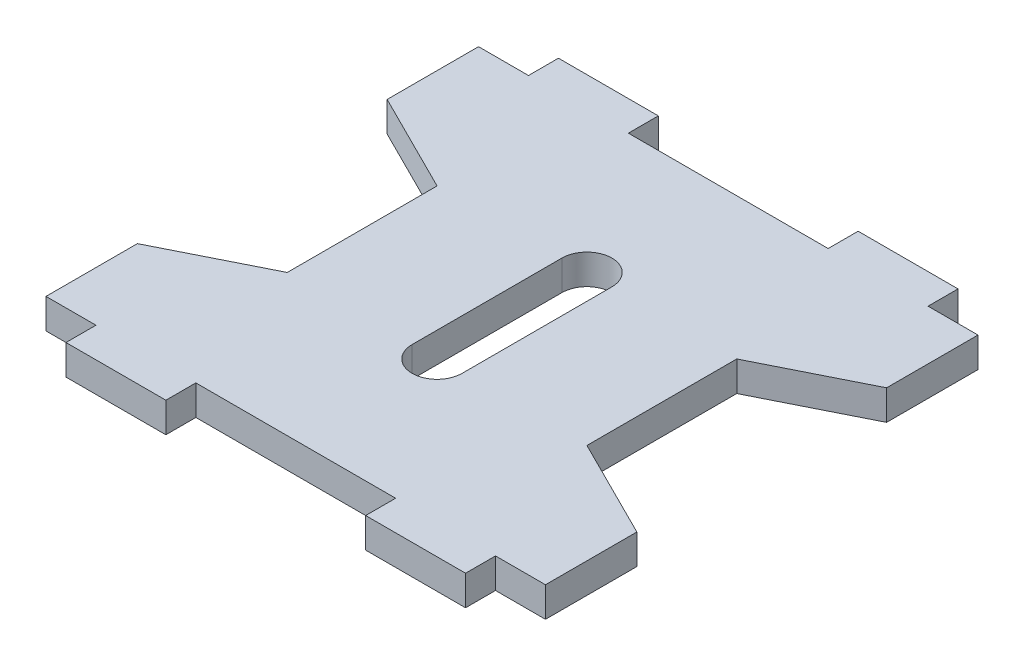
ISO-10303-21;
HEADER;
FILE_DESCRIPTION(('STEP AP214'),'2;1');
FILE_NAME('part.step','',(''),(''),'','','');
FILE_SCHEMA(('AUTOMOTIVE_DESIGN { 1 0 10303 214 1 1 1 1 }'));
ENDSEC;
DATA;
#1=APPLICATION_CONTEXT('core data for automotive mechanical design processes');
#2=APPLICATION_PROTOCOL_DEFINITION('international standard','automotive_design',2000,#1);
#3=PRODUCT_CONTEXT('',#1,'mechanical');
#4=PRODUCT('Part','Part','',(#3));
#5=PRODUCT_RELATED_PRODUCT_CATEGORY('part','',(#4));
#6=PRODUCT_DEFINITION_FORMATION('','',#4);
#7=PRODUCT_DEFINITION_CONTEXT('part definition',#1,'design');
#8=PRODUCT_DEFINITION('design','',#6,#7);
#9=PRODUCT_DEFINITION_SHAPE('','',#8);
#10=(LENGTH_UNIT() NAMED_UNIT(*) SI_UNIT(.MILLI.,.METRE.));
#11=(NAMED_UNIT(*) PLANE_ANGLE_UNIT() SI_UNIT($,.RADIAN.));
#12=(NAMED_UNIT(*) SI_UNIT($,.STERADIAN.) SOLID_ANGLE_UNIT());
#13=UNCERTAINTY_MEASURE_WITH_UNIT(LENGTH_MEASURE(1.E-05),#10,'distance_accuracy_value','');
#14=(GEOMETRIC_REPRESENTATION_CONTEXT(3) GLOBAL_UNCERTAINTY_ASSIGNED_CONTEXT((#13)) GLOBAL_UNIT_ASSIGNED_CONTEXT((#10,
#11,#12)) REPRESENTATION_CONTEXT('',''));
#15=CARTESIAN_POINT('',(0.,0.,0.));
#16=DIRECTION('',(0.,0.,1.));
#17=DIRECTION('',(1.,0.,0.));
#18=AXIS2_PLACEMENT_3D('',#15,#16,#17);
#19=CARTESIAN_POINT('',(0.,3.,0.));
#20=DIRECTION('',(0.,1.,0.));
#21=DIRECTION('',(0.,0.,1.));
#22=AXIS2_PLACEMENT_3D('',#19,#20,#21);
#23=PLANE('',#22);
#24=DIRECTION('',(0.894427190999916,0.,-0.447213595499958));
#25=VECTOR('',#24,1.);
#26=CARTESIAN_POINT('',(15.,3.,-7.5));
#27=LINE('',#26,#25);
#28=CARTESIAN_POINT('',(15.,3.,-7.5));
#29=VERTEX_POINT('',#28);
#30=CARTESIAN_POINT('',(25.,3.,-12.5));
#31=VERTEX_POINT('',#30);
#32=EDGE_CURVE('E297',#29,#31,#27,.T.);
#33=ORIENTED_EDGE('',*,*,#32,.T.);
#34=DIRECTION('',(0.,0.,-1.));
#35=VECTOR('',#34,1.);
#36=CARTESIAN_POINT('',(25.,3.,-12.5));
#37=LINE('',#36,#35);
#38=CARTESIAN_POINT('',(25.,3.,-21.65));
#39=VERTEX_POINT('',#38);
#40=EDGE_CURVE('E301',#31,#39,#37,.T.);
#41=ORIENTED_EDGE('',*,*,#40,.T.);
#42=DIRECTION('',(-1.,0.,0.));
#43=VECTOR('',#42,1.);
#44=CARTESIAN_POINT('',(25.,3.,-21.65));
#45=LINE('',#44,#43);
#46=CARTESIAN_POINT('',(20.,3.,-21.65));
#47=VERTEX_POINT('',#46);
#48=EDGE_CURVE('E305',#39,#47,#45,.T.);
#49=ORIENTED_EDGE('',*,*,#48,.T.);
#50=DIRECTION('',(0.,0.,-1.));
#51=VECTOR('',#50,1.);
#52=CARTESIAN_POINT('',(20.,3.,-21.65));
#53=LINE('',#52,#51);
#54=CARTESIAN_POINT('',(20.,3.,-24.65));
#55=VERTEX_POINT('',#54);
#56=EDGE_CURVE('E308',#47,#55,#53,.T.);
#57=ORIENTED_EDGE('',*,*,#56,.T.);
#58=DIRECTION('',(-1.,0.,0.));
#59=VECTOR('',#58,1.);
#60=CARTESIAN_POINT('',(20.,3.,-24.65));
#61=LINE('',#60,#59);
#62=CARTESIAN_POINT('',(10.,3.,-24.65));
#63=VERTEX_POINT('',#62);
#64=EDGE_CURVE('E311',#55,#63,#61,.T.);
#65=ORIENTED_EDGE('',*,*,#64,.T.);
#66=DIRECTION('',(0.,0.,1.));
#67=VECTOR('',#66,1.);
#68=CARTESIAN_POINT('',(10.,3.,-24.65));
#69=LINE('',#68,#67);
#70=CARTESIAN_POINT('',(10.,3.,-21.65));
#71=VERTEX_POINT('',#70);
#72=EDGE_CURVE('E314',#63,#71,#69,.T.);
#73=ORIENTED_EDGE('',*,*,#72,.T.);
#74=DIRECTION('',(-1.,0.,0.));
#75=VECTOR('',#74,1.);
#76=CARTESIAN_POINT('',(10.,3.,-21.65));
#77=LINE('',#76,#75);
#78=CARTESIAN_POINT('',(-10.,3.,-21.65));
#79=VERTEX_POINT('',#78);
#80=EDGE_CURVE('E317',#71,#79,#77,.T.);
#81=ORIENTED_EDGE('',*,*,#80,.T.);
#82=DIRECTION('',(0.,0.,-1.));
#83=VECTOR('',#82,1.);
#84=CARTESIAN_POINT('',(-10.,3.,-24.65));
#85=LINE('',#84,#83);
#86=CARTESIAN_POINT('',(-10.,3.,-24.65));
#87=VERTEX_POINT('',#86);
#88=EDGE_CURVE('E320',#79,#87,#85,.T.);
#89=ORIENTED_EDGE('',*,*,#88,.T.);
#90=DIRECTION('',(-1.,0.,0.));
#91=VECTOR('',#90,1.);
#92=CARTESIAN_POINT('',(-20.,3.,-24.65));
#93=LINE('',#92,#91);
#94=CARTESIAN_POINT('',(-20.,3.,-24.65));
#95=VERTEX_POINT('',#94);
#96=EDGE_CURVE('E323',#87,#95,#93,.T.);
#97=ORIENTED_EDGE('',*,*,#96,.T.);
#98=DIRECTION('',(0.,0.,1.));
#99=VECTOR('',#98,1.);
#100=CARTESIAN_POINT('',(-20.,3.,-21.65));
#101=LINE('',#100,#99);
#102=CARTESIAN_POINT('',(-20.,3.,-21.65));
#103=VERTEX_POINT('',#102);
#104=EDGE_CURVE('E326',#95,#103,#101,.T.);
#105=ORIENTED_EDGE('',*,*,#104,.T.);
#106=DIRECTION('',(-1.,0.,0.));
#107=VECTOR('',#106,1.);
#108=CARTESIAN_POINT('',(-25.,3.,-21.65));
#109=LINE('',#108,#107);
#110=CARTESIAN_POINT('',(-25.,3.,-21.65));
#111=VERTEX_POINT('',#110);
#112=EDGE_CURVE('E329',#103,#111,#109,.T.);
#113=ORIENTED_EDGE('',*,*,#112,.T.);
#114=DIRECTION('',(0.,0.,1.));
#115=VECTOR('',#114,1.);
#116=CARTESIAN_POINT('',(-25.,3.,-12.5));
#117=LINE('',#116,#115);
#118=CARTESIAN_POINT('',(-25.,3.,-12.5));
#119=VERTEX_POINT('',#118);
#120=EDGE_CURVE('E332',#111,#119,#117,.T.);
#121=ORIENTED_EDGE('',*,*,#120,.T.);
#122=DIRECTION('',(0.894427190999916,0.,0.447213595499958));
#123=VECTOR('',#122,1.);
#124=CARTESIAN_POINT('',(-15.,3.,-7.49999999999999));
#125=LINE('',#124,#123);
#126=CARTESIAN_POINT('',(-15.,3.,-7.49999999999999));
#127=VERTEX_POINT('',#126);
#128=EDGE_CURVE('E335',#119,#127,#125,.T.);
#129=ORIENTED_EDGE('',*,*,#128,.T.);
#130=DIRECTION('',(0.,0.,1.));
#131=VECTOR('',#130,1.);
#132=CARTESIAN_POINT('',(-15.,3.,7.50000000000001));
#133=LINE('',#132,#131);
#134=CARTESIAN_POINT('',(-15.,3.,7.50000000000001));
#135=VERTEX_POINT('',#134);
#136=EDGE_CURVE('E338',#127,#135,#133,.T.);
#137=ORIENTED_EDGE('',*,*,#136,.T.);
#138=DIRECTION('',(-0.894427190999916,0.,0.447213595499958));
#139=VECTOR('',#138,1.);
#140=CARTESIAN_POINT('',(-15.,3.,7.50000000000001));
#141=LINE('',#140,#139);
#142=CARTESIAN_POINT('',(-25.,3.,12.5));
#143=VERTEX_POINT('',#142);
#144=EDGE_CURVE('E341',#135,#143,#141,.T.);
#145=ORIENTED_EDGE('',*,*,#144,.T.);
#146=DIRECTION('',(0.,0.,1.));
#147=VECTOR('',#146,1.);
#148=CARTESIAN_POINT('',(-25.,3.,12.5));
#149=LINE('',#148,#147);
#150=CARTESIAN_POINT('',(-25.,3.,21.65));
#151=VERTEX_POINT('',#150);
#152=EDGE_CURVE('E344',#143,#151,#149,.T.);
#153=ORIENTED_EDGE('',*,*,#152,.T.);
#154=DIRECTION('',(1.,0.,0.));
#155=VECTOR('',#154,1.);
#156=CARTESIAN_POINT('',(-25.,3.,21.65));
#157=LINE('',#156,#155);
#158=CARTESIAN_POINT('',(-20.,3.,21.65));
#159=VERTEX_POINT('',#158);
#160=EDGE_CURVE('E347',#151,#159,#157,.T.);
#161=ORIENTED_EDGE('',*,*,#160,.T.);
#162=DIRECTION('',(0.,0.,1.));
#163=VECTOR('',#162,1.);
#164=CARTESIAN_POINT('',(-20.,3.,21.65));
#165=LINE('',#164,#163);
#166=CARTESIAN_POINT('',(-20.,3.,24.65));
#167=VERTEX_POINT('',#166);
#168=EDGE_CURVE('E350',#159,#167,#165,.T.);
#169=ORIENTED_EDGE('',*,*,#168,.T.);
#170=DIRECTION('',(1.,0.,0.));
#171=VECTOR('',#170,1.);
#172=CARTESIAN_POINT('',(-20.,3.,24.65));
#173=LINE('',#172,#171);
#174=CARTESIAN_POINT('',(-10.,3.,24.65));
#175=VERTEX_POINT('',#174);
#176=EDGE_CURVE('E353',#167,#175,#173,.T.);
#177=ORIENTED_EDGE('',*,*,#176,.T.);
#178=DIRECTION('',(0.,0.,-1.));
#179=VECTOR('',#178,1.);
#180=CARTESIAN_POINT('',(-10.,3.,24.65));
#181=LINE('',#180,#179);
#182=CARTESIAN_POINT('',(-10.,3.,21.65));
#183=VERTEX_POINT('',#182);
#184=EDGE_CURVE('E356',#175,#183,#181,.T.);
#185=ORIENTED_EDGE('',*,*,#184,.T.);
#186=DIRECTION('',(1.,0.,0.));
#187=VECTOR('',#186,1.);
#188=CARTESIAN_POINT('',(10.,3.,21.65));
#189=LINE('',#188,#187);
#190=CARTESIAN_POINT('',(10.,3.,21.65));
#191=VERTEX_POINT('',#190);
#192=EDGE_CURVE('E359',#183,#191,#189,.T.);
#193=ORIENTED_EDGE('',*,*,#192,.T.);
#194=DIRECTION('',(0.,0.,1.));
#195=VECTOR('',#194,1.);
#196=CARTESIAN_POINT('',(10.,3.,24.65));
#197=LINE('',#196,#195);
#198=CARTESIAN_POINT('',(10.,3.,24.65));
#199=VERTEX_POINT('',#198);
#200=EDGE_CURVE('E362',#191,#199,#197,.T.);
#201=ORIENTED_EDGE('',*,*,#200,.T.);
#202=DIRECTION('',(1.,0.,0.));
#203=VECTOR('',#202,1.);
#204=CARTESIAN_POINT('',(20.,3.,24.65));
#205=LINE('',#204,#203);
#206=CARTESIAN_POINT('',(20.,3.,24.65));
#207=VERTEX_POINT('',#206);
#208=EDGE_CURVE('E365',#199,#207,#205,.T.);
#209=ORIENTED_EDGE('',*,*,#208,.T.);
#210=DIRECTION('',(0.,0.,-1.));
#211=VECTOR('',#210,1.);
#212=CARTESIAN_POINT('',(20.,3.,21.65));
#213=LINE('',#212,#211);
#214=CARTESIAN_POINT('',(20.,3.,21.65));
#215=VERTEX_POINT('',#214);
#216=EDGE_CURVE('E368',#207,#215,#213,.T.);
#217=ORIENTED_EDGE('',*,*,#216,.T.);
#218=DIRECTION('',(1.,0.,0.));
#219=VECTOR('',#218,1.);
#220=CARTESIAN_POINT('',(25.,3.,21.65));
#221=LINE('',#220,#219);
#222=CARTESIAN_POINT('',(25.,3.,21.65));
#223=VERTEX_POINT('',#222);
#224=EDGE_CURVE('E371',#215,#223,#221,.T.);
#225=ORIENTED_EDGE('',*,*,#224,.T.);
#226=DIRECTION('',(0.,0.,-1.));
#227=VECTOR('',#226,1.);
#228=CARTESIAN_POINT('',(25.,3.,12.5));
#229=LINE('',#228,#227);
#230=CARTESIAN_POINT('',(25.,3.,12.5));
#231=VERTEX_POINT('',#230);
#232=EDGE_CURVE('E374',#223,#231,#229,.T.);
#233=ORIENTED_EDGE('',*,*,#232,.T.);
#234=DIRECTION('',(-0.894427190999916,0.,-0.447213595499958));
#235=VECTOR('',#234,1.);
#236=CARTESIAN_POINT('',(15.,3.,7.5));
#237=LINE('',#236,#235);
#238=CARTESIAN_POINT('',(15.,3.,7.5));
#239=VERTEX_POINT('',#238);
#240=EDGE_CURVE('E377',#231,#239,#237,.T.);
#241=ORIENTED_EDGE('',*,*,#240,.T.);
#242=DIRECTION('',(0.,0.,-1.));
#243=VECTOR('',#242,1.);
#244=CARTESIAN_POINT('',(15.,3.,7.5));
#245=LINE('',#244,#243);
#246=EDGE_CURVE('E380',#239,#29,#245,.T.);
#247=ORIENTED_EDGE('',*,*,#246,.T.);
#248=EDGE_LOOP('',(#33,#41,#49,#57,#65,#73,#81,#89,#97,#105,#113,#121,#129,#137,#145,#153,#161,
#169,#177,#185,#193,#201,#209,#217,#225,#233,#241,#247));
#249=FACE_BOUND('',#248,.T.);
#250=DIRECTION('',(0.,0.,1.));
#251=VECTOR('',#250,1.);
#252=CARTESIAN_POINT('',(-2.50000000000001,3.,-7.49999999999999));
#253=LINE('',#252,#251);
#254=CARTESIAN_POINT('',(-2.50000000000001,3.,-7.49999999999999));
#255=VERTEX_POINT('',#254);
#256=CARTESIAN_POINT('',(-2.50000000000001,3.,7.5));
#257=VERTEX_POINT('',#256);
#258=EDGE_CURVE('E258',#255,#257,#253,.T.);
#259=ORIENTED_EDGE('',*,*,#258,.F.);
#260=CARTESIAN_POINT('',(0.,3.,-7.49999999999999));
#261=DIRECTION('',(0.,1.,0.));
#262=DIRECTION('',(0.,0.,1.));
#263=AXIS2_PLACEMENT_3D('',#260,#261,#262);
#264=CIRCLE('',#263,2.5);
#265=CARTESIAN_POINT('',(2.5,3.,-7.49999999999999));
#266=VERTEX_POINT('',#265);
#267=EDGE_CURVE('E249',#266,#255,#264,.T.);
#268=ORIENTED_EDGE('',*,*,#267,.F.);
#269=DIRECTION('',(0.,0.,-1.));
#270=VECTOR('',#269,1.);
#271=CARTESIAN_POINT('',(2.5,3.,-7.49999999999999));
#272=LINE('',#271,#270);
#273=CARTESIAN_POINT('',(2.5,3.,7.5));
#274=VERTEX_POINT('',#273);
#275=EDGE_CURVE('E275',#274,#266,#272,.T.);
#276=ORIENTED_EDGE('',*,*,#275,.F.);
#277=CARTESIAN_POINT('',(0.,3.,7.50000000000001));
#278=DIRECTION('',(0.,1.,0.));
#279=DIRECTION('',(0.,0.,-1.));
#280=AXIS2_PLACEMENT_3D('',#277,#278,#279);
#281=CIRCLE('',#280,2.5);
#282=EDGE_CURVE('E271',#257,#274,#281,.T.);
#283=ORIENTED_EDGE('',*,*,#282,.F.);
#284=EDGE_LOOP('',(#259,#268,#276,#283));
#285=FACE_BOUND('',#284,.T.);
#286=ADVANCED_FACE('F39',(#249,#285),#23,.T.);
#287=CARTESIAN_POINT('',(0.,0.,0.));
#288=DIRECTION('',(0.,1.,0.));
#289=DIRECTION('',(0.,0.,1.));
#290=AXIS2_PLACEMENT_3D('',#287,#288,#289);
#291=PLANE('',#290);
#292=DIRECTION('',(0.894427190999916,0.,-0.447213595499958));
#293=VECTOR('',#292,1.);
#294=CARTESIAN_POINT('',(15.,0.,-7.5));
#295=LINE('',#294,#293);
#296=CARTESIAN_POINT('',(15.,0.,-7.5));
#297=VERTEX_POINT('',#296);
#298=CARTESIAN_POINT('',(25.,0.,-12.5));
#299=VERTEX_POINT('',#298);
#300=EDGE_CURVE('E267',#297,#299,#295,.T.);
#301=ORIENTED_EDGE('',*,*,#300,.F.);
#302=DIRECTION('',(0.,0.,-1.));
#303=VECTOR('',#302,1.);
#304=CARTESIAN_POINT('',(15.,0.,7.5));
#305=LINE('',#304,#303);
#306=CARTESIAN_POINT('',(15.,0.,7.5));
#307=VERTEX_POINT('',#306);
#308=EDGE_CURVE('E302',#307,#297,#305,.T.);
#309=ORIENTED_EDGE('',*,*,#308,.F.);
#310=DIRECTION('',(-0.894427190999916,0.,-0.447213595499958));
#311=VECTOR('',#310,1.);
#312=CARTESIAN_POINT('',(15.,0.,7.5));
#313=LINE('',#312,#311);
#314=CARTESIAN_POINT('',(25.,0.,12.5));
#315=VERTEX_POINT('',#314);
#316=EDGE_CURVE('E462',#315,#307,#313,.T.);
#317=ORIENTED_EDGE('',*,*,#316,.F.);
#318=DIRECTION('',(0.,0.,-1.));
#319=VECTOR('',#318,1.);
#320=CARTESIAN_POINT('',(25.,0.,12.5));
#321=LINE('',#320,#319);
#322=CARTESIAN_POINT('',(25.,0.,21.65));
#323=VERTEX_POINT('',#322);
#324=EDGE_CURVE('E459',#323,#315,#321,.T.);
#325=ORIENTED_EDGE('',*,*,#324,.F.);
#326=DIRECTION('',(1.,0.,0.));
#327=VECTOR('',#326,1.);
#328=CARTESIAN_POINT('',(25.,0.,21.65));
#329=LINE('',#328,#327);
#330=CARTESIAN_POINT('',(20.,0.,21.65));
#331=VERTEX_POINT('',#330);
#332=EDGE_CURVE('E456',#331,#323,#329,.T.);
#333=ORIENTED_EDGE('',*,*,#332,.F.);
#334=DIRECTION('',(0.,0.,-1.));
#335=VECTOR('',#334,1.);
#336=CARTESIAN_POINT('',(20.,0.,21.65));
#337=LINE('',#336,#335);
#338=CARTESIAN_POINT('',(20.,0.,24.65));
#339=VERTEX_POINT('',#338);
#340=EDGE_CURVE('E453',#339,#331,#337,.T.);
#341=ORIENTED_EDGE('',*,*,#340,.F.);
#342=DIRECTION('',(1.,0.,0.));
#343=VECTOR('',#342,1.);
#344=CARTESIAN_POINT('',(20.,0.,24.65));
#345=LINE('',#344,#343);
#346=CARTESIAN_POINT('',(10.,0.,24.65));
#347=VERTEX_POINT('',#346);
#348=EDGE_CURVE('E450',#347,#339,#345,.T.);
#349=ORIENTED_EDGE('',*,*,#348,.F.);
#350=DIRECTION('',(0.,0.,1.));
#351=VECTOR('',#350,1.);
#352=CARTESIAN_POINT('',(10.,0.,24.65));
#353=LINE('',#352,#351);
#354=CARTESIAN_POINT('',(10.,0.,21.65));
#355=VERTEX_POINT('',#354);
#356=EDGE_CURVE('E447',#355,#347,#353,.T.);
#357=ORIENTED_EDGE('',*,*,#356,.F.);
#358=DIRECTION('',(1.,0.,0.));
#359=VECTOR('',#358,1.);
#360=CARTESIAN_POINT('',(10.,0.,21.65));
#361=LINE('',#360,#359);
#362=CARTESIAN_POINT('',(-10.,0.,21.65));
#363=VERTEX_POINT('',#362);
#364=EDGE_CURVE('E444',#363,#355,#361,.T.);
#365=ORIENTED_EDGE('',*,*,#364,.F.);
#366=DIRECTION('',(0.,0.,-1.));
#367=VECTOR('',#366,1.);
#368=CARTESIAN_POINT('',(-10.,0.,24.65));
#369=LINE('',#368,#367);
#370=CARTESIAN_POINT('',(-10.,0.,24.65));
#371=VERTEX_POINT('',#370);
#372=EDGE_CURVE('E441',#371,#363,#369,.T.);
#373=ORIENTED_EDGE('',*,*,#372,.F.);
#374=DIRECTION('',(1.,0.,0.));
#375=VECTOR('',#374,1.);
#376=CARTESIAN_POINT('',(-20.,0.,24.65));
#377=LINE('',#376,#375);
#378=CARTESIAN_POINT('',(-20.,0.,24.65));
#379=VERTEX_POINT('',#378);
#380=EDGE_CURVE('E438',#379,#371,#377,.T.);
#381=ORIENTED_EDGE('',*,*,#380,.F.);
#382=DIRECTION('',(0.,0.,1.));
#383=VECTOR('',#382,1.);
#384=CARTESIAN_POINT('',(-20.,0.,21.65));
#385=LINE('',#384,#383);
#386=CARTESIAN_POINT('',(-20.,0.,21.65));
#387=VERTEX_POINT('',#386);
#388=EDGE_CURVE('E435',#387,#379,#385,.T.);
#389=ORIENTED_EDGE('',*,*,#388,.F.);
#390=DIRECTION('',(1.,0.,0.));
#391=VECTOR('',#390,1.);
#392=CARTESIAN_POINT('',(-25.,0.,21.65));
#393=LINE('',#392,#391);
#394=CARTESIAN_POINT('',(-25.,0.,21.65));
#395=VERTEX_POINT('',#394);
#396=EDGE_CURVE('E432',#395,#387,#393,.T.);
#397=ORIENTED_EDGE('',*,*,#396,.F.);
#398=DIRECTION('',(0.,0.,1.));
#399=VECTOR('',#398,1.);
#400=CARTESIAN_POINT('',(-25.,0.,12.5));
#401=LINE('',#400,#399);
#402=CARTESIAN_POINT('',(-25.,0.,12.5));
#403=VERTEX_POINT('',#402);
#404=EDGE_CURVE('E429',#403,#395,#401,.T.);
#405=ORIENTED_EDGE('',*,*,#404,.F.);
#406=DIRECTION('',(-0.894427190999916,0.,0.447213595499958));
#407=VECTOR('',#406,1.);
#408=CARTESIAN_POINT('',(-15.,0.,7.50000000000001));
#409=LINE('',#408,#407);
#410=CARTESIAN_POINT('',(-15.,0.,7.50000000000001));
#411=VERTEX_POINT('',#410);
#412=EDGE_CURVE('E426',#411,#403,#409,.T.);
#413=ORIENTED_EDGE('',*,*,#412,.F.);
#414=DIRECTION('',(0.,0.,1.));
#415=VECTOR('',#414,1.);
#416=CARTESIAN_POINT('',(-15.,0.,7.50000000000001));
#417=LINE('',#416,#415);
#418=CARTESIAN_POINT('',(-15.,0.,-7.49999999999999));
#419=VERTEX_POINT('',#418);
#420=EDGE_CURVE('E423',#419,#411,#417,.T.);
#421=ORIENTED_EDGE('',*,*,#420,.F.);
#422=DIRECTION('',(0.894427190999916,0.,0.447213595499958));
#423=VECTOR('',#422,1.);
#424=CARTESIAN_POINT('',(-15.,0.,-7.49999999999999));
#425=LINE('',#424,#423);
#426=CARTESIAN_POINT('',(-25.,0.,-12.5));
#427=VERTEX_POINT('',#426);
#428=EDGE_CURVE('E420',#427,#419,#425,.T.);
#429=ORIENTED_EDGE('',*,*,#428,.F.);
#430=DIRECTION('',(0.,0.,1.));
#431=VECTOR('',#430,1.);
#432=CARTESIAN_POINT('',(-25.,0.,-12.5));
#433=LINE('',#432,#431);
#434=CARTESIAN_POINT('',(-25.,0.,-21.65));
#435=VERTEX_POINT('',#434);
#436=EDGE_CURVE('E417',#435,#427,#433,.T.);
#437=ORIENTED_EDGE('',*,*,#436,.F.);
#438=DIRECTION('',(-1.,0.,0.));
#439=VECTOR('',#438,1.);
#440=CARTESIAN_POINT('',(-25.,0.,-21.65));
#441=LINE('',#440,#439);
#442=CARTESIAN_POINT('',(-20.,0.,-21.65));
#443=VERTEX_POINT('',#442);
#444=EDGE_CURVE('E414',#443,#435,#441,.T.);
#445=ORIENTED_EDGE('',*,*,#444,.F.);
#446=DIRECTION('',(0.,0.,1.));
#447=VECTOR('',#446,1.);
#448=CARTESIAN_POINT('',(-20.,0.,-21.65));
#449=LINE('',#448,#447);
#450=CARTESIAN_POINT('',(-20.,0.,-24.65));
#451=VERTEX_POINT('',#450);
#452=EDGE_CURVE('E411',#451,#443,#449,.T.);
#453=ORIENTED_EDGE('',*,*,#452,.F.);
#454=DIRECTION('',(-1.,0.,0.));
#455=VECTOR('',#454,1.);
#456=CARTESIAN_POINT('',(-20.,0.,-24.65));
#457=LINE('',#456,#455);
#458=CARTESIAN_POINT('',(-10.,0.,-24.65));
#459=VERTEX_POINT('',#458);
#460=EDGE_CURVE('E408',#459,#451,#457,.T.);
#461=ORIENTED_EDGE('',*,*,#460,.F.);
#462=DIRECTION('',(0.,0.,-1.));
#463=VECTOR('',#462,1.);
#464=CARTESIAN_POINT('',(-10.,0.,-24.65));
#465=LINE('',#464,#463);
#466=CARTESIAN_POINT('',(-10.,0.,-21.65));
#467=VERTEX_POINT('',#466);
#468=EDGE_CURVE('E405',#467,#459,#465,.T.);
#469=ORIENTED_EDGE('',*,*,#468,.F.);
#470=DIRECTION('',(-1.,0.,0.));
#471=VECTOR('',#470,1.);
#472=CARTESIAN_POINT('',(10.,0.,-21.65));
#473=LINE('',#472,#471);
#474=CARTESIAN_POINT('',(10.,0.,-21.65));
#475=VERTEX_POINT('',#474);
#476=EDGE_CURVE('E402',#475,#467,#473,.T.);
#477=ORIENTED_EDGE('',*,*,#476,.F.);
#478=DIRECTION('',(0.,0.,1.));
#479=VECTOR('',#478,1.);
#480=CARTESIAN_POINT('',(10.,0.,-24.65));
#481=LINE('',#480,#479);
#482=CARTESIAN_POINT('',(10.,0.,-24.65));
#483=VERTEX_POINT('',#482);
#484=EDGE_CURVE('E399',#483,#475,#481,.T.);
#485=ORIENTED_EDGE('',*,*,#484,.F.);
#486=DIRECTION('',(-1.,0.,0.));
#487=VECTOR('',#486,1.);
#488=CARTESIAN_POINT('',(20.,0.,-24.65));
#489=LINE('',#488,#487);
#490=CARTESIAN_POINT('',(20.,0.,-24.65));
#491=VERTEX_POINT('',#490);
#492=EDGE_CURVE('E396',#491,#483,#489,.T.);
#493=ORIENTED_EDGE('',*,*,#492,.F.);
#494=DIRECTION('',(0.,0.,-1.));
#495=VECTOR('',#494,1.);
#496=CARTESIAN_POINT('',(20.,0.,-21.65));
#497=LINE('',#496,#495);
#498=CARTESIAN_POINT('',(20.,0.,-21.65));
#499=VERTEX_POINT('',#498);
#500=EDGE_CURVE('E393',#499,#491,#497,.T.);
#501=ORIENTED_EDGE('',*,*,#500,.F.);
#502=DIRECTION('',(-1.,0.,0.));
#503=VECTOR('',#502,1.);
#504=CARTESIAN_POINT('',(25.,0.,-21.65));
#505=LINE('',#504,#503);
#506=CARTESIAN_POINT('',(25.,0.,-21.65));
#507=VERTEX_POINT('',#506);
#508=EDGE_CURVE('E390',#507,#499,#505,.T.);
#509=ORIENTED_EDGE('',*,*,#508,.F.);
#510=DIRECTION('',(0.,0.,-1.));
#511=VECTOR('',#510,1.);
#512=CARTESIAN_POINT('',(25.,0.,-12.5));
#513=LINE('',#512,#511);
#514=EDGE_CURVE('E387',#299,#507,#513,.T.);
#515=ORIENTED_EDGE('',*,*,#514,.F.);
#516=EDGE_LOOP('',(#301,#309,#317,#325,#333,#341,#349,#357,#365,#373,#381,#389,#397,#405,#413,
#421,#429,#437,#445,#453,#461,#469,#477,#485,#493,#501,#509,#515));
#517=FACE_BOUND('',#516,.T.);
#518=CARTESIAN_POINT('',(0.,0.,-7.49999999999999));
#519=DIRECTION('',(0.,1.,0.));
#520=DIRECTION('',(0.,0.,1.));
#521=AXIS2_PLACEMENT_3D('',#518,#519,#520);
#522=CIRCLE('',#521,2.5);
#523=CARTESIAN_POINT('',(2.5,0.,-7.49999999999999));
#524=VERTEX_POINT('',#523);
#525=CARTESIAN_POINT('',(-2.50000000000001,0.,-7.49999999999999));
#526=VERTEX_POINT('',#525);
#527=EDGE_CURVE('E63',#524,#526,#522,.T.);
#528=ORIENTED_EDGE('',*,*,#527,.T.);
#529=DIRECTION('',(0.,0.,1.));
#530=VECTOR('',#529,1.);
#531=CARTESIAN_POINT('',(-2.50000000000001,0.,-7.49999999999999));
#532=LINE('',#531,#530);
#533=CARTESIAN_POINT('',(-2.50000000000001,0.,7.5));
#534=VERTEX_POINT('',#533);
#535=EDGE_CURVE('E265',#526,#534,#532,.T.);
#536=ORIENTED_EDGE('',*,*,#535,.T.);
#537=CARTESIAN_POINT('',(0.,0.,7.50000000000001));
#538=DIRECTION('',(0.,1.,0.));
#539=DIRECTION('',(0.,0.,-1.));
#540=AXIS2_PLACEMENT_3D('',#537,#538,#539);
#541=CIRCLE('',#540,2.5);
#542=CARTESIAN_POINT('',(2.5,0.,7.5));
#543=VERTEX_POINT('',#542);
#544=EDGE_CURVE('E284',#534,#543,#541,.T.);
#545=ORIENTED_EDGE('',*,*,#544,.T.);
#546=DIRECTION('',(0.,0.,-1.));
#547=VECTOR('',#546,1.);
#548=CARTESIAN_POINT('',(2.5,0.,-7.49999999999999));
#549=LINE('',#548,#547);
#550=EDGE_CURVE('E259',#543,#524,#549,.T.);
#551=ORIENTED_EDGE('',*,*,#550,.T.);
#552=EDGE_LOOP('',(#528,#536,#545,#551));
#553=FACE_BOUND('',#552,.T.);
#554=ADVANCED_FACE('F581',(#517,#553),#291,.F.);
#555=CARTESIAN_POINT('',(15.,3.,-7.5));
#556=DIRECTION('',(-0.447213595499958,0.,-0.894427190999916));
#557=DIRECTION('',(-0.894427190999916,0.,0.447213595499958));
#558=AXIS2_PLACEMENT_3D('',#555,#556,#557);
#559=PLANE('',#558);
#560=ORIENTED_EDGE('',*,*,#300,.T.);
#561=DIRECTION('',(0.,-1.,0.));
#562=VECTOR('',#561,1.);
#563=CARTESIAN_POINT('',(25.,3.,-12.5));
#564=LINE('',#563,#562);
#565=EDGE_CURVE('E11',#31,#299,#564,.T.);
#566=ORIENTED_EDGE('',*,*,#565,.F.);
#567=ORIENTED_EDGE('',*,*,#32,.F.);
#568=DIRECTION('',(0.,-1.,0.));
#569=VECTOR('',#568,1.);
#570=CARTESIAN_POINT('',(15.,3.,-7.5));
#571=LINE('',#570,#569);
#572=EDGE_CURVE('E383',#29,#297,#571,.T.);
#573=ORIENTED_EDGE('',*,*,#572,.T.);
#574=EDGE_LOOP('',(#560,#566,#567,#573));
#575=FACE_BOUND('',#574,.T.);
#576=ADVANCED_FACE('F41',(#575),#559,.F.);
#577=CARTESIAN_POINT('',(25.,3.,-12.5));
#578=DIRECTION('',(-1.,0.,0.));
#579=DIRECTION('',(0.,0.,1.));
#580=AXIS2_PLACEMENT_3D('',#577,#578,#579);
#581=PLANE('',#580);
#582=ORIENTED_EDGE('',*,*,#514,.T.);
#583=DIRECTION('',(0.,-1.,0.));
#584=VECTOR('',#583,1.);
#585=CARTESIAN_POINT('',(25.,3.,-21.65));
#586=LINE('',#585,#584);
#587=EDGE_CURVE('E48',#39,#507,#586,.T.);
#588=ORIENTED_EDGE('',*,*,#587,.F.);
#589=ORIENTED_EDGE('',*,*,#40,.F.);
#590=ORIENTED_EDGE('',*,*,#565,.T.);
#591=EDGE_LOOP('',(#582,#588,#589,#590));
#592=FACE_BOUND('',#591,.T.);
#593=ADVANCED_FACE('F598',(#592),#581,.F.);
#594=CARTESIAN_POINT('',(25.,3.,-21.65));
#595=DIRECTION('',(0.,0.,1.));
#596=DIRECTION('',(1.,0.,0.));
#597=AXIS2_PLACEMENT_3D('',#594,#595,#596);
#598=PLANE('',#597);
#599=ORIENTED_EDGE('',*,*,#508,.T.);
#600=DIRECTION('',(0.,-1.,0.));
#601=VECTOR('',#600,1.);
#602=CARTESIAN_POINT('',(20.,3.,-21.65));
#603=LINE('',#602,#601);
#604=EDGE_CURVE('E566',#47,#499,#603,.T.);
#605=ORIENTED_EDGE('',*,*,#604,.F.);
#606=ORIENTED_EDGE('',*,*,#48,.F.);
#607=ORIENTED_EDGE('',*,*,#587,.T.);
#608=EDGE_LOOP('',(#599,#605,#606,#607));
#609=FACE_BOUND('',#608,.T.);
#610=ADVANCED_FACE('F575',(#609),#598,.F.);
#611=CARTESIAN_POINT('',(20.,3.,-21.65));
#612=DIRECTION('',(-1.,0.,0.));
#613=DIRECTION('',(0.,0.,1.));
#614=AXIS2_PLACEMENT_3D('',#611,#612,#613);
#615=PLANE('',#614);
#616=ORIENTED_EDGE('',*,*,#500,.T.);
#617=DIRECTION('',(0.,-1.,0.));
#618=VECTOR('',#617,1.);
#619=CARTESIAN_POINT('',(20.,3.,-24.65));
#620=LINE('',#619,#618);
#621=EDGE_CURVE('E562',#55,#491,#620,.T.);
#622=ORIENTED_EDGE('',*,*,#621,.F.);
#623=ORIENTED_EDGE('',*,*,#56,.F.);
#624=ORIENTED_EDGE('',*,*,#604,.T.);
#625=EDGE_LOOP('',(#616,#622,#623,#624));
#626=FACE_BOUND('',#625,.T.);
#627=ADVANCED_FACE('F587',(#626),#615,.F.);
#628=CARTESIAN_POINT('',(20.,3.,-24.65));
#629=DIRECTION('',(0.,0.,1.));
#630=DIRECTION('',(1.,0.,0.));
#631=AXIS2_PLACEMENT_3D('',#628,#629,#630);
#632=PLANE('',#631);
#633=ORIENTED_EDGE('',*,*,#492,.T.);
#634=DIRECTION('',(0.,-1.,0.));
#635=VECTOR('',#634,1.);
#636=CARTESIAN_POINT('',(10.,3.,-24.65));
#637=LINE('',#636,#635);
#638=EDGE_CURVE('E558',#63,#483,#637,.T.);
#639=ORIENTED_EDGE('',*,*,#638,.F.);
#640=ORIENTED_EDGE('',*,*,#64,.F.);
#641=ORIENTED_EDGE('',*,*,#621,.T.);
#642=EDGE_LOOP('',(#633,#639,#640,#641));
#643=FACE_BOUND('',#642,.T.);
#644=ADVANCED_FACE('F591',(#643),#632,.F.);
#645=CARTESIAN_POINT('',(10.,3.,-24.65));
#646=DIRECTION('',(1.,0.,0.));
#647=DIRECTION('',(0.,0.,-1.));
#648=AXIS2_PLACEMENT_3D('',#645,#646,#647);
#649=PLANE('',#648);
#650=ORIENTED_EDGE('',*,*,#484,.T.);
#651=DIRECTION('',(0.,-1.,0.));
#652=VECTOR('',#651,1.);
#653=CARTESIAN_POINT('',(10.,3.,-21.65));
#654=LINE('',#653,#652);
#655=EDGE_CURVE('E554',#71,#475,#654,.T.);
#656=ORIENTED_EDGE('',*,*,#655,.F.);
#657=ORIENTED_EDGE('',*,*,#72,.F.);
#658=ORIENTED_EDGE('',*,*,#638,.T.);
#659=EDGE_LOOP('',(#650,#656,#657,#658));
#660=FACE_BOUND('',#659,.T.);
#661=ADVANCED_FACE('F711',(#660),#649,.F.);
#662=CARTESIAN_POINT('',(10.,3.,-21.65));
#663=DIRECTION('',(0.,0.,1.));
#664=DIRECTION('',(1.,0.,0.));
#665=AXIS2_PLACEMENT_3D('',#662,#663,#664);
#666=PLANE('',#665);
#667=ORIENTED_EDGE('',*,*,#476,.T.);
#668=DIRECTION('',(0.,-1.,0.));
#669=VECTOR('',#668,1.);
#670=CARTESIAN_POINT('',(-10.,3.,-21.65));
#671=LINE('',#670,#669);
#672=EDGE_CURVE('E550',#79,#467,#671,.T.);
#673=ORIENTED_EDGE('',*,*,#672,.F.);
#674=ORIENTED_EDGE('',*,*,#80,.F.);
#675=ORIENTED_EDGE('',*,*,#655,.T.);
#676=EDGE_LOOP('',(#667,#673,#674,#675));
#677=FACE_BOUND('',#676,.T.);
#678=ADVANCED_FACE('F708',(#677),#666,.F.);
#679=CARTESIAN_POINT('',(-10.,3.,-24.65));
#680=DIRECTION('',(-1.,0.,0.));
#681=DIRECTION('',(0.,0.,1.));
#682=AXIS2_PLACEMENT_3D('',#679,#680,#681);
#683=PLANE('',#682);
#684=ORIENTED_EDGE('',*,*,#468,.T.);
#685=DIRECTION('',(0.,-1.,0.));
#686=VECTOR('',#685,1.);
#687=CARTESIAN_POINT('',(-10.,3.,-24.65));
#688=LINE('',#687,#686);
#689=EDGE_CURVE('E546',#87,#459,#688,.T.);
#690=ORIENTED_EDGE('',*,*,#689,.F.);
#691=ORIENTED_EDGE('',*,*,#88,.F.);
#692=ORIENTED_EDGE('',*,*,#672,.T.);
#693=EDGE_LOOP('',(#684,#690,#691,#692));
#694=FACE_BOUND('',#693,.T.);
#695=ADVANCED_FACE('F704',(#694),#683,.F.);
#696=CARTESIAN_POINT('',(-20.,3.,-24.65));
#697=DIRECTION('',(0.,0.,1.));
#698=DIRECTION('',(1.,0.,0.));
#699=AXIS2_PLACEMENT_3D('',#696,#697,#698);
#700=PLANE('',#699);
#701=ORIENTED_EDGE('',*,*,#460,.T.);
#702=DIRECTION('',(0.,-1.,0.));
#703=VECTOR('',#702,1.);
#704=CARTESIAN_POINT('',(-20.,3.,-24.65));
#705=LINE('',#704,#703);
#706=EDGE_CURVE('E542',#95,#451,#705,.T.);
#707=ORIENTED_EDGE('',*,*,#706,.F.);
#708=ORIENTED_EDGE('',*,*,#96,.F.);
#709=ORIENTED_EDGE('',*,*,#689,.T.);
#710=EDGE_LOOP('',(#701,#707,#708,#709));
#711=FACE_BOUND('',#710,.T.);
#712=ADVANCED_FACE('F700',(#711),#700,.F.);
#713=CARTESIAN_POINT('',(-20.,3.,-21.65));
#714=DIRECTION('',(1.,0.,0.));
#715=DIRECTION('',(0.,0.,-1.));
#716=AXIS2_PLACEMENT_3D('',#713,#714,#715);
#717=PLANE('',#716);
#718=ORIENTED_EDGE('',*,*,#452,.T.);
#719=DIRECTION('',(0.,-1.,0.));
#720=VECTOR('',#719,1.);
#721=CARTESIAN_POINT('',(-20.,3.,-21.65));
#722=LINE('',#721,#720);
#723=EDGE_CURVE('E538',#103,#443,#722,.T.);
#724=ORIENTED_EDGE('',*,*,#723,.F.);
#725=ORIENTED_EDGE('',*,*,#104,.F.);
#726=ORIENTED_EDGE('',*,*,#706,.T.);
#727=EDGE_LOOP('',(#718,#724,#725,#726));
#728=FACE_BOUND('',#727,.T.);
#729=ADVANCED_FACE('F695',(#728),#717,.F.);
#730=CARTESIAN_POINT('',(-25.,3.,-21.65));
#731=DIRECTION('',(0.,0.,1.));
#732=DIRECTION('',(1.,0.,0.));
#733=AXIS2_PLACEMENT_3D('',#730,#731,#732);
#734=PLANE('',#733);
#735=ORIENTED_EDGE('',*,*,#444,.T.);
#736=DIRECTION('',(0.,-1.,0.));
#737=VECTOR('',#736,1.);
#738=CARTESIAN_POINT('',(-25.,3.,-21.65));
#739=LINE('',#738,#737);
#740=EDGE_CURVE('E534',#111,#435,#739,.T.);
#741=ORIENTED_EDGE('',*,*,#740,.F.);
#742=ORIENTED_EDGE('',*,*,#112,.F.);
#743=ORIENTED_EDGE('',*,*,#723,.T.);
#744=EDGE_LOOP('',(#735,#741,#742,#743));
#745=FACE_BOUND('',#744,.T.);
#746=ADVANCED_FACE('F689',(#745),#734,.F.);
#747=CARTESIAN_POINT('',(-25.,3.,-12.5));
#748=DIRECTION('',(1.,0.,0.));
#749=DIRECTION('',(0.,0.,-1.));
#750=AXIS2_PLACEMENT_3D('',#747,#748,#749);
#751=PLANE('',#750);
#752=ORIENTED_EDGE('',*,*,#436,.T.);
#753=DIRECTION('',(0.,-1.,0.));
#754=VECTOR('',#753,1.);
#755=CARTESIAN_POINT('',(-25.,3.,-12.5));
#756=LINE('',#755,#754);
#757=EDGE_CURVE('E530',#119,#427,#756,.T.);
#758=ORIENTED_EDGE('',*,*,#757,.F.);
#759=ORIENTED_EDGE('',*,*,#120,.F.);
#760=ORIENTED_EDGE('',*,*,#740,.T.);
#761=EDGE_LOOP('',(#752,#758,#759,#760));
#762=FACE_BOUND('',#761,.T.);
#763=ADVANCED_FACE('F685',(#762),#751,.F.);
#764=CARTESIAN_POINT('',(-15.,3.,-7.49999999999999));
#765=DIRECTION('',(0.447213595499958,0.,-0.894427190999916));
#766=DIRECTION('',(-0.894427190999916,0.,-0.447213595499958));
#767=AXIS2_PLACEMENT_3D('',#764,#765,#766);
#768=PLANE('',#767);
#769=ORIENTED_EDGE('',*,*,#428,.T.);
#770=DIRECTION('',(0.,-1.,0.));
#771=VECTOR('',#770,1.);
#772=CARTESIAN_POINT('',(-15.,3.,-7.49999999999999));
#773=LINE('',#772,#771);
#774=EDGE_CURVE('E526',#127,#419,#773,.T.);
#775=ORIENTED_EDGE('',*,*,#774,.F.);
#776=ORIENTED_EDGE('',*,*,#128,.F.);
#777=ORIENTED_EDGE('',*,*,#757,.T.);
#778=EDGE_LOOP('',(#769,#775,#776,#777));
#779=FACE_BOUND('',#778,.T.);
#780=ADVANCED_FACE('F680',(#779),#768,.F.);
#781=CARTESIAN_POINT('',(-15.,3.,7.50000000000001));
#782=DIRECTION('',(1.,0.,0.));
#783=DIRECTION('',(0.,0.,-1.));
#784=AXIS2_PLACEMENT_3D('',#781,#782,#783);
#785=PLANE('',#784);
#786=ORIENTED_EDGE('',*,*,#420,.T.);
#787=DIRECTION('',(0.,-1.,0.));
#788=VECTOR('',#787,1.);
#789=CARTESIAN_POINT('',(-15.,3.,7.50000000000001));
#790=LINE('',#789,#788);
#791=EDGE_CURVE('E522',#135,#411,#790,.T.);
#792=ORIENTED_EDGE('',*,*,#791,.F.);
#793=ORIENTED_EDGE('',*,*,#136,.F.);
#794=ORIENTED_EDGE('',*,*,#774,.T.);
#795=EDGE_LOOP('',(#786,#792,#793,#794));
#796=FACE_BOUND('',#795,.T.);
#797=ADVANCED_FACE('F674',(#796),#785,.F.);
#798=CARTESIAN_POINT('',(-15.,3.,7.50000000000001));
#799=DIRECTION('',(0.447213595499958,0.,0.894427190999916));
#800=DIRECTION('',(0.894427190999916,0.,-0.447213595499958));
#801=AXIS2_PLACEMENT_3D('',#798,#799,#800);
#802=PLANE('',#801);
#803=ORIENTED_EDGE('',*,*,#412,.T.);
#804=DIRECTION('',(0.,-1.,0.));
#805=VECTOR('',#804,1.);
#806=CARTESIAN_POINT('',(-25.,3.,12.5));
#807=LINE('',#806,#805);
#808=EDGE_CURVE('E518',#143,#403,#807,.T.);
#809=ORIENTED_EDGE('',*,*,#808,.F.);
#810=ORIENTED_EDGE('',*,*,#144,.F.);
#811=ORIENTED_EDGE('',*,*,#791,.T.);
#812=EDGE_LOOP('',(#803,#809,#810,#811));
#813=FACE_BOUND('',#812,.T.);
#814=ADVANCED_FACE('F670',(#813),#802,.F.);
#815=CARTESIAN_POINT('',(-25.,3.,12.5));
#816=DIRECTION('',(1.,0.,0.));
#817=DIRECTION('',(0.,0.,-1.));
#818=AXIS2_PLACEMENT_3D('',#815,#816,#817);
#819=PLANE('',#818);
#820=ORIENTED_EDGE('',*,*,#404,.T.);
#821=DIRECTION('',(0.,-1.,0.));
#822=VECTOR('',#821,1.);
#823=CARTESIAN_POINT('',(-25.,3.,21.65));
#824=LINE('',#823,#822);
#825=EDGE_CURVE('E514',#151,#395,#824,.T.);
#826=ORIENTED_EDGE('',*,*,#825,.F.);
#827=ORIENTED_EDGE('',*,*,#152,.F.);
#828=ORIENTED_EDGE('',*,*,#808,.T.);
#829=EDGE_LOOP('',(#820,#826,#827,#828));
#830=FACE_BOUND('',#829,.T.);
#831=ADVANCED_FACE('F665',(#830),#819,.F.);
#832=CARTESIAN_POINT('',(-25.,3.,21.65));
#833=DIRECTION('',(0.,0.,-1.));
#834=DIRECTION('',(-1.,0.,0.));
#835=AXIS2_PLACEMENT_3D('',#832,#833,#834);
#836=PLANE('',#835);
#837=ORIENTED_EDGE('',*,*,#396,.T.);
#838=DIRECTION('',(0.,-1.,0.));
#839=VECTOR('',#838,1.);
#840=CARTESIAN_POINT('',(-20.,3.,21.65));
#841=LINE('',#840,#839);
#842=EDGE_CURVE('E510',#159,#387,#841,.T.);
#843=ORIENTED_EDGE('',*,*,#842,.F.);
#844=ORIENTED_EDGE('',*,*,#160,.F.);
#845=ORIENTED_EDGE('',*,*,#825,.T.);
#846=EDGE_LOOP('',(#837,#843,#844,#845));
#847=FACE_BOUND('',#846,.T.);
#848=ADVANCED_FACE('F659',(#847),#836,.F.);
#849=CARTESIAN_POINT('',(-20.,3.,21.65));
#850=DIRECTION('',(1.,0.,0.));
#851=DIRECTION('',(0.,0.,-1.));
#852=AXIS2_PLACEMENT_3D('',#849,#850,#851);
#853=PLANE('',#852);
#854=ORIENTED_EDGE('',*,*,#388,.T.);
#855=DIRECTION('',(0.,-1.,0.));
#856=VECTOR('',#855,1.);
#857=CARTESIAN_POINT('',(-20.,3.,24.65));
#858=LINE('',#857,#856);
#859=EDGE_CURVE('E506',#167,#379,#858,.T.);
#860=ORIENTED_EDGE('',*,*,#859,.F.);
#861=ORIENTED_EDGE('',*,*,#168,.F.);
#862=ORIENTED_EDGE('',*,*,#842,.T.);
#863=EDGE_LOOP('',(#854,#860,#861,#862));
#864=FACE_BOUND('',#863,.T.);
#865=ADVANCED_FACE('F655',(#864),#853,.F.);
#866=CARTESIAN_POINT('',(-20.,3.,24.65));
#867=DIRECTION('',(0.,0.,-1.));
#868=DIRECTION('',(-1.,0.,0.));
#869=AXIS2_PLACEMENT_3D('',#866,#867,#868);
#870=PLANE('',#869);
#871=ORIENTED_EDGE('',*,*,#380,.T.);
#872=DIRECTION('',(0.,-1.,0.));
#873=VECTOR('',#872,1.);
#874=CARTESIAN_POINT('',(-10.,3.,24.65));
#875=LINE('',#874,#873);
#876=EDGE_CURVE('E502',#175,#371,#875,.T.);
#877=ORIENTED_EDGE('',*,*,#876,.F.);
#878=ORIENTED_EDGE('',*,*,#176,.F.);
#879=ORIENTED_EDGE('',*,*,#859,.T.);
#880=EDGE_LOOP('',(#871,#877,#878,#879));
#881=FACE_BOUND('',#880,.T.);
#882=ADVANCED_FACE('F650',(#881),#870,.F.);
#883=CARTESIAN_POINT('',(-10.,3.,24.65));
#884=DIRECTION('',(-1.,0.,0.));
#885=DIRECTION('',(0.,0.,1.));
#886=AXIS2_PLACEMENT_3D('',#883,#884,#885);
#887=PLANE('',#886);
#888=ORIENTED_EDGE('',*,*,#372,.T.);
#889=DIRECTION('',(0.,-1.,0.));
#890=VECTOR('',#889,1.);
#891=CARTESIAN_POINT('',(-10.,3.,21.65));
#892=LINE('',#891,#890);
#893=EDGE_CURVE('E498',#183,#363,#892,.T.);
#894=ORIENTED_EDGE('',*,*,#893,.F.);
#895=ORIENTED_EDGE('',*,*,#184,.F.);
#896=ORIENTED_EDGE('',*,*,#876,.T.);
#897=EDGE_LOOP('',(#888,#894,#895,#896));
#898=FACE_BOUND('',#897,.T.);
#899=ADVANCED_FACE('F644',(#898),#887,.F.);
#900=CARTESIAN_POINT('',(10.,3.,21.65));
#901=DIRECTION('',(0.,0.,-1.));
#902=DIRECTION('',(-1.,0.,0.));
#903=AXIS2_PLACEMENT_3D('',#900,#901,#902);
#904=PLANE('',#903);
#905=ORIENTED_EDGE('',*,*,#364,.T.);
#906=DIRECTION('',(0.,-1.,0.));
#907=VECTOR('',#906,1.);
#908=CARTESIAN_POINT('',(10.,3.,21.65));
#909=LINE('',#908,#907);
#910=EDGE_CURVE('E494',#191,#355,#909,.T.);
#911=ORIENTED_EDGE('',*,*,#910,.F.);
#912=ORIENTED_EDGE('',*,*,#192,.F.);
#913=ORIENTED_EDGE('',*,*,#893,.T.);
#914=EDGE_LOOP('',(#905,#911,#912,#913));
#915=FACE_BOUND('',#914,.T.);
#916=ADVANCED_FACE('F640',(#915),#904,.F.);
#917=CARTESIAN_POINT('',(10.,3.,24.65));
#918=DIRECTION('',(1.,0.,0.));
#919=DIRECTION('',(0.,0.,-1.));
#920=AXIS2_PLACEMENT_3D('',#917,#918,#919);
#921=PLANE('',#920);
#922=ORIENTED_EDGE('',*,*,#356,.T.);
#923=DIRECTION('',(0.,-1.,0.));
#924=VECTOR('',#923,1.);
#925=CARTESIAN_POINT('',(10.,3.,24.65));
#926=LINE('',#925,#924);
#927=EDGE_CURVE('E490',#199,#347,#926,.T.);
#928=ORIENTED_EDGE('',*,*,#927,.F.);
#929=ORIENTED_EDGE('',*,*,#200,.F.);
#930=ORIENTED_EDGE('',*,*,#910,.T.);
#931=EDGE_LOOP('',(#922,#928,#929,#930));
#932=FACE_BOUND('',#931,.T.);
#933=ADVANCED_FACE('F635',(#932),#921,.F.);
#934=CARTESIAN_POINT('',(20.,3.,24.65));
#935=DIRECTION('',(0.,0.,-1.));
#936=DIRECTION('',(-1.,0.,0.));
#937=AXIS2_PLACEMENT_3D('',#934,#935,#936);
#938=PLANE('',#937);
#939=ORIENTED_EDGE('',*,*,#348,.T.);
#940=DIRECTION('',(0.,-1.,0.));
#941=VECTOR('',#940,1.);
#942=CARTESIAN_POINT('',(20.,3.,24.65));
#943=LINE('',#942,#941);
#944=EDGE_CURVE('E486',#207,#339,#943,.T.);
#945=ORIENTED_EDGE('',*,*,#944,.F.);
#946=ORIENTED_EDGE('',*,*,#208,.F.);
#947=ORIENTED_EDGE('',*,*,#927,.T.);
#948=EDGE_LOOP('',(#939,#945,#946,#947));
#949=FACE_BOUND('',#948,.T.);
#950=ADVANCED_FACE('F629',(#949),#938,.F.);
#951=CARTESIAN_POINT('',(20.,3.,21.65));
#952=DIRECTION('',(-1.,0.,0.));
#953=DIRECTION('',(0.,0.,1.));
#954=AXIS2_PLACEMENT_3D('',#951,#952,#953);
#955=PLANE('',#954);
#956=ORIENTED_EDGE('',*,*,#340,.T.);
#957=DIRECTION('',(0.,-1.,0.));
#958=VECTOR('',#957,1.);
#959=CARTESIAN_POINT('',(20.,3.,21.65));
#960=LINE('',#959,#958);
#961=EDGE_CURVE('E482',#215,#331,#960,.T.);
#962=ORIENTED_EDGE('',*,*,#961,.F.);
#963=ORIENTED_EDGE('',*,*,#216,.F.);
#964=ORIENTED_EDGE('',*,*,#944,.T.);
#965=EDGE_LOOP('',(#956,#962,#963,#964));
#966=FACE_BOUND('',#965,.T.);
#967=ADVANCED_FACE('F625',(#966),#955,.F.);
#968=CARTESIAN_POINT('',(25.,3.,21.65));
#969=DIRECTION('',(0.,0.,-1.));
#970=DIRECTION('',(-1.,0.,0.));
#971=AXIS2_PLACEMENT_3D('',#968,#969,#970);
#972=PLANE('',#971);
#973=ORIENTED_EDGE('',*,*,#332,.T.);
#974=DIRECTION('',(0.,-1.,0.));
#975=VECTOR('',#974,1.);
#976=CARTESIAN_POINT('',(25.,3.,21.65));
#977=LINE('',#976,#975);
#978=EDGE_CURVE('E478',#223,#323,#977,.T.);
#979=ORIENTED_EDGE('',*,*,#978,.F.);
#980=ORIENTED_EDGE('',*,*,#224,.F.);
#981=ORIENTED_EDGE('',*,*,#961,.T.);
#982=EDGE_LOOP('',(#973,#979,#980,#981));
#983=FACE_BOUND('',#982,.T.);
#984=ADVANCED_FACE('F620',(#983),#972,.F.);
#985=CARTESIAN_POINT('',(25.,3.,12.5));
#986=DIRECTION('',(-1.,0.,0.));
#987=DIRECTION('',(0.,0.,1.));
#988=AXIS2_PLACEMENT_3D('',#985,#986,#987);
#989=PLANE('',#988);
#990=ORIENTED_EDGE('',*,*,#324,.T.);
#991=DIRECTION('',(0.,-1.,0.));
#992=VECTOR('',#991,1.);
#993=CARTESIAN_POINT('',(25.,3.,12.5));
#994=LINE('',#993,#992);
#995=EDGE_CURVE('E474',#231,#315,#994,.T.);
#996=ORIENTED_EDGE('',*,*,#995,.F.);
#997=ORIENTED_EDGE('',*,*,#232,.F.);
#998=ORIENTED_EDGE('',*,*,#978,.T.);
#999=EDGE_LOOP('',(#990,#996,#997,#998));
#1000=FACE_BOUND('',#999,.T.);
#1001=ADVANCED_FACE('F614',(#1000),#989,.F.);
#1002=CARTESIAN_POINT('',(15.,3.,7.5));
#1003=DIRECTION('',(-0.447213595499958,0.,0.894427190999916));
#1004=DIRECTION('',(0.894427190999916,0.,0.447213595499958));
#1005=AXIS2_PLACEMENT_3D('',#1002,#1003,#1004);
#1006=PLANE('',#1005);
#1007=ORIENTED_EDGE('',*,*,#316,.T.);
#1008=DIRECTION('',(0.,-1.,0.));
#1009=VECTOR('',#1008,1.);
#1010=CARTESIAN_POINT('',(15.,3.,7.5));
#1011=LINE('',#1010,#1009);
#1012=EDGE_CURVE('E470',#239,#307,#1011,.T.);
#1013=ORIENTED_EDGE('',*,*,#1012,.F.);
#1014=ORIENTED_EDGE('',*,*,#240,.F.);
#1015=ORIENTED_EDGE('',*,*,#995,.T.);
#1016=EDGE_LOOP('',(#1007,#1013,#1014,#1015));
#1017=FACE_BOUND('',#1016,.T.);
#1018=ADVANCED_FACE('F610',(#1017),#1006,.F.);
#1019=CARTESIAN_POINT('',(15.,3.,7.5));
#1020=DIRECTION('',(-1.,0.,0.));
#1021=DIRECTION('',(0.,0.,1.));
#1022=AXIS2_PLACEMENT_3D('',#1019,#1020,#1021);
#1023=PLANE('',#1022);
#1024=ORIENTED_EDGE('',*,*,#308,.T.);
#1025=ORIENTED_EDGE('',*,*,#572,.F.);
#1026=ORIENTED_EDGE('',*,*,#246,.F.);
#1027=ORIENTED_EDGE('',*,*,#1012,.T.);
#1028=EDGE_LOOP('',(#1024,#1025,#1026,#1027));
#1029=FACE_BOUND('',#1028,.T.);
#1030=ADVANCED_FACE('F605',(#1029),#1023,.F.);
#1031=CARTESIAN_POINT('',(0.,3.,-7.49999999999999));
#1032=DIRECTION('',(0.,-1.,0.));
#1033=DIRECTION('',(0.,0.,-1.));
#1034=AXIS2_PLACEMENT_3D('',#1031,#1032,#1033);
#1035=CYLINDRICAL_SURFACE('',#1034,2.5);
#1036=ORIENTED_EDGE('',*,*,#527,.F.);
#1037=DIRECTION('',(0.,-1.,0.));
#1038=VECTOR('',#1037,1.);
#1039=CARTESIAN_POINT('',(2.5,3.,-7.49999999999999));
#1040=LINE('',#1039,#1038);
#1041=EDGE_CURVE('E253',#266,#524,#1040,.T.);
#1042=ORIENTED_EDGE('',*,*,#1041,.F.);
#1043=ORIENTED_EDGE('',*,*,#267,.T.);
#1044=DIRECTION('',(0.,-1.,0.));
#1045=VECTOR('',#1044,1.);
#1046=CARTESIAN_POINT('',(-2.50000000000001,3.,-7.49999999999999));
#1047=LINE('',#1046,#1045);
#1048=EDGE_CURVE('E252',#255,#526,#1047,.T.);
#1049=ORIENTED_EDGE('',*,*,#1048,.T.);
#1050=EDGE_LOOP('',(#1036,#1042,#1043,#1049));
#1051=FACE_BOUND('',#1050,.T.);
#1052=ADVANCED_FACE('F251',(#1051),#1035,.F.);
#1053=CARTESIAN_POINT('',(-2.50000000000001,3.,-7.49999999999999));
#1054=DIRECTION('',(1.,0.,0.));
#1055=DIRECTION('',(0.,0.,-1.));
#1056=AXIS2_PLACEMENT_3D('',#1053,#1054,#1055);
#1057=PLANE('',#1056);
#1058=ORIENTED_EDGE('',*,*,#535,.F.);
#1059=ORIENTED_EDGE('',*,*,#1048,.F.);
#1060=ORIENTED_EDGE('',*,*,#258,.T.);
#1061=DIRECTION('',(0.,-1.,0.));
#1062=VECTOR('',#1061,1.);
#1063=CARTESIAN_POINT('',(-2.50000000000001,3.,7.5));
#1064=LINE('',#1063,#1062);
#1065=EDGE_CURVE('E268',#257,#534,#1064,.T.);
#1066=ORIENTED_EDGE('',*,*,#1065,.T.);
#1067=EDGE_LOOP('',(#1058,#1059,#1060,#1066));
#1068=FACE_BOUND('',#1067,.T.);
#1069=ADVANCED_FACE('F262',(#1068),#1057,.T.);
#1070=CARTESIAN_POINT('',(0.,3.,7.50000000000001));
#1071=DIRECTION('',(0.,-1.,0.));
#1072=DIRECTION('',(0.,0.,-1.));
#1073=AXIS2_PLACEMENT_3D('',#1070,#1071,#1072);
#1074=CYLINDRICAL_SURFACE('',#1073,2.5);
#1075=ORIENTED_EDGE('',*,*,#544,.F.);
#1076=ORIENTED_EDGE('',*,*,#1065,.F.);
#1077=ORIENTED_EDGE('',*,*,#282,.T.);
#1078=DIRECTION('',(0.,-1.,0.));
#1079=VECTOR('',#1078,1.);
#1080=CARTESIAN_POINT('',(2.5,3.,7.5));
#1081=LINE('',#1080,#1079);
#1082=EDGE_CURVE('E55',#274,#543,#1081,.T.);
#1083=ORIENTED_EDGE('',*,*,#1082,.T.);
#1084=EDGE_LOOP('',(#1075,#1076,#1077,#1083));
#1085=FACE_BOUND('',#1084,.T.);
#1086=ADVANCED_FACE('F865',(#1085),#1074,.F.);
#1087=CARTESIAN_POINT('',(2.5,3.,-7.49999999999999));
#1088=DIRECTION('',(-1.,0.,0.));
#1089=DIRECTION('',(0.,0.,1.));
#1090=AXIS2_PLACEMENT_3D('',#1087,#1088,#1089);
#1091=PLANE('',#1090);
#1092=ORIENTED_EDGE('',*,*,#550,.F.);
#1093=ORIENTED_EDGE('',*,*,#1082,.F.);
#1094=ORIENTED_EDGE('',*,*,#275,.T.);
#1095=ORIENTED_EDGE('',*,*,#1041,.T.);
#1096=EDGE_LOOP('',(#1092,#1093,#1094,#1095));
#1097=FACE_BOUND('',#1096,.T.);
#1098=ADVANCED_FACE('F871',(#1097),#1091,.T.);
#1099=CLOSED_SHELL('',(#286,#554,#576,#593,#610,#627,#644,#661,#678,#695,#712,#729,#746,#763,
#780,#797,#814,#831,#848,#865,#882,#899,#916,#933,#950,#967,#984,#1001,#1018,#1030,#1052,#1069,
#1086,#1098));
#1100=MANIFOLD_SOLID_BREP('B2',#1099);
#1101=ADVANCED_BREP_SHAPE_REPRESENTATION('',(#18,#1100),#14);
#1102=SHAPE_DEFINITION_REPRESENTATION(#9,#1101);
ENDSEC;
END-ISO-10303-21;
